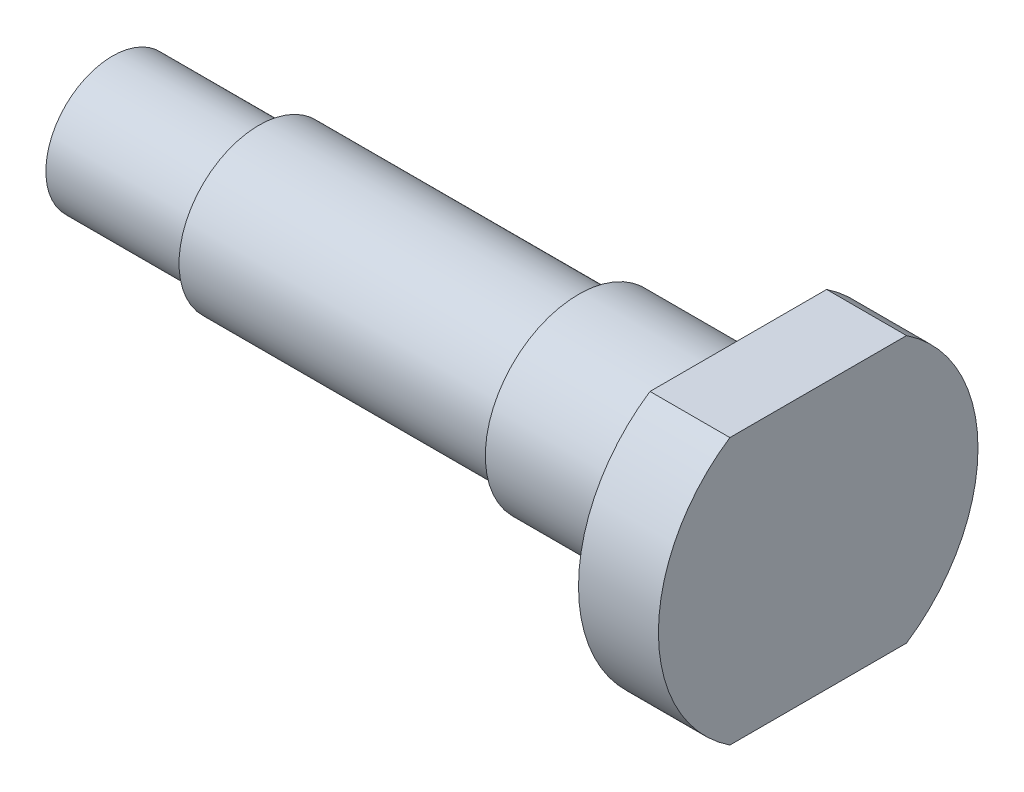
ISO-10303-21;
HEADER;
FILE_DESCRIPTION(('STEP AP214'),'2;1');
FILE_NAME('part.step','',(''),(''),'','','');
FILE_SCHEMA(('AUTOMOTIVE_DESIGN { 1 0 10303 214 1 1 1 1 }'));
ENDSEC;
DATA;
#1=APPLICATION_CONTEXT('core data for automotive mechanical design processes');
#2=APPLICATION_PROTOCOL_DEFINITION('international standard','automotive_design',2000,#1);
#3=PRODUCT_CONTEXT('',#1,'mechanical');
#4=PRODUCT('Part','Part','',(#3));
#5=PRODUCT_RELATED_PRODUCT_CATEGORY('part','',(#4));
#6=PRODUCT_DEFINITION_FORMATION('','',#4);
#7=PRODUCT_DEFINITION_CONTEXT('part definition',#1,'design');
#8=PRODUCT_DEFINITION('design','',#6,#7);
#9=PRODUCT_DEFINITION_SHAPE('','',#8);
#10=(LENGTH_UNIT() NAMED_UNIT(*) SI_UNIT(.MILLI.,.METRE.));
#11=(NAMED_UNIT(*) PLANE_ANGLE_UNIT() SI_UNIT($,.RADIAN.));
#12=(NAMED_UNIT(*) SI_UNIT($,.STERADIAN.) SOLID_ANGLE_UNIT());
#13=UNCERTAINTY_MEASURE_WITH_UNIT(LENGTH_MEASURE(1.E-05),#10,'distance_accuracy_value','');
#14=(GEOMETRIC_REPRESENTATION_CONTEXT(3) GLOBAL_UNCERTAINTY_ASSIGNED_CONTEXT((#13)) GLOBAL_UNIT_ASSIGNED_CONTEXT((#10,
#11,#12)) REPRESENTATION_CONTEXT('',''));
#15=CARTESIAN_POINT('',(0.,0.,0.));
#16=DIRECTION('',(0.,0.,1.));
#17=DIRECTION('',(1.,0.,0.));
#18=AXIS2_PLACEMENT_3D('',#15,#16,#17);
#19=CARTESIAN_POINT('',(-18.,0.,0.));
#20=DIRECTION('',(1.,0.,0.));
#21=DIRECTION('',(0.,0.,-1.));
#22=AXIS2_PLACEMENT_3D('',#19,#20,#21);
#23=CYLINDRICAL_SURFACE('',#22,3.);
#24=CARTESIAN_POINT('',(-18.,0.,0.));
#25=DIRECTION('',(1.,0.,0.));
#26=DIRECTION('',(0.,0.,-1.));
#27=AXIS2_PLACEMENT_3D('',#24,#25,#26);
#28=CIRCLE('',#27,3.);
#29=CARTESIAN_POINT('',(-18.,0.,-3.));
#30=VERTEX_POINT('',#29);
#31=EDGE_CURVE('E105',#30,#30,#28,.T.);
#32=ORIENTED_EDGE('',*,*,#31,.T.);
#33=EDGE_LOOP('',(#32));
#34=FACE_BOUND('',#33,.T.);
#35=CARTESIAN_POINT('',(-6.,0.,0.));
#36=DIRECTION('',(1.,0.,0.));
#37=DIRECTION('',(0.,0.,-1.));
#38=AXIS2_PLACEMENT_3D('',#35,#36,#37);
#39=CIRCLE('',#38,3.);
#40=CARTESIAN_POINT('',(-6.,0.,-3.));
#41=VERTEX_POINT('',#40);
#42=EDGE_CURVE('E176',#41,#41,#39,.T.);
#43=ORIENTED_EDGE('',*,*,#42,.F.);
#44=EDGE_LOOP('',(#43));
#45=FACE_BOUND('',#44,.T.);
#46=ADVANCED_FACE('F39',(#34,#45),#23,.T.);
#47=CARTESIAN_POINT('',(-18.,0.,0.));
#48=DIRECTION('',(1.,0.,0.));
#49=DIRECTION('',(0.,0.,-1.));
#50=AXIS2_PLACEMENT_3D('',#47,#48,#49);
#51=PLANE('',#50);
#52=CARTESIAN_POINT('',(-18.,0.,0.));
#53=DIRECTION('',(1.,0.,0.));
#54=DIRECTION('',(0.,0.,-1.));
#55=AXIS2_PLACEMENT_3D('',#52,#53,#54);
#56=CIRCLE('',#55,2.5);
#57=CARTESIAN_POINT('',(-18.,0.,-2.5));
#58=VERTEX_POINT('',#57);
#59=EDGE_CURVE('E168',#58,#58,#56,.T.);
#60=ORIENTED_EDGE('',*,*,#59,.T.);
#61=EDGE_LOOP('',(#60));
#62=FACE_BOUND('',#61,.T.);
#63=ORIENTED_EDGE('',*,*,#31,.F.);
#64=EDGE_LOOP('',(#63));
#65=FACE_BOUND('',#64,.T.);
#66=ADVANCED_FACE('F126',(#62,#65),#51,.F.);
#67=CARTESIAN_POINT('',(-23.5,0.,0.));
#68=DIRECTION('',(1.,0.,0.));
#69=DIRECTION('',(0.,0.,-1.));
#70=AXIS2_PLACEMENT_3D('',#67,#68,#69);
#71=CYLINDRICAL_SURFACE('',#70,2.5);
#72=CARTESIAN_POINT('',(-23.5,0.,0.));
#73=DIRECTION('',(1.,0.,0.));
#74=DIRECTION('',(0.,0.,-1.));
#75=AXIS2_PLACEMENT_3D('',#72,#73,#74);
#76=CIRCLE('',#75,2.5);
#77=CARTESIAN_POINT('',(-23.5,0.,-2.5));
#78=VERTEX_POINT('',#77);
#79=EDGE_CURVE('E165',#78,#78,#76,.T.);
#80=ORIENTED_EDGE('',*,*,#79,.T.);
#81=EDGE_LOOP('',(#80));
#82=FACE_BOUND('',#81,.T.);
#83=ORIENTED_EDGE('',*,*,#59,.F.);
#84=EDGE_LOOP('',(#83));
#85=FACE_BOUND('',#84,.T.);
#86=ADVANCED_FACE('F132',(#82,#85),#71,.T.);
#87=CARTESIAN_POINT('',(-23.5,0.,0.));
#88=DIRECTION('',(1.,0.,0.));
#89=DIRECTION('',(0.,0.,-1.));
#90=AXIS2_PLACEMENT_3D('',#87,#88,#89);
#91=PLANE('',#90);
#92=ORIENTED_EDGE('',*,*,#79,.F.);
#93=EDGE_LOOP('',(#92));
#94=FACE_BOUND('',#93,.T.);
#95=ADVANCED_FACE('F150',(#94),#91,.F.);
#96=CARTESIAN_POINT('',(-6.,0.,0.));
#97=DIRECTION('',(1.,0.,0.));
#98=DIRECTION('',(0.,0.,-1.));
#99=AXIS2_PLACEMENT_3D('',#96,#97,#98);
#100=CYLINDRICAL_SURFACE('',#99,3.5);
#101=CARTESIAN_POINT('',(-6.,0.,0.));
#102=DIRECTION('',(1.,0.,0.));
#103=DIRECTION('',(0.,0.,-1.));
#104=AXIS2_PLACEMENT_3D('',#101,#102,#103);
#105=CIRCLE('',#104,3.5);
#106=CARTESIAN_POINT('',(-6.,0.,-3.5));
#107=VERTEX_POINT('',#106);
#108=EDGE_CURVE('E171',#107,#107,#105,.T.);
#109=ORIENTED_EDGE('',*,*,#108,.T.);
#110=EDGE_LOOP('',(#109));
#111=FACE_BOUND('',#110,.T.);
#112=CARTESIAN_POINT('',(0.,0.,0.));
#113=DIRECTION('',(1.,0.,0.));
#114=DIRECTION('',(0.,0.,-1.));
#115=AXIS2_PLACEMENT_3D('',#112,#113,#114);
#116=CIRCLE('',#115,3.5);
#117=CARTESIAN_POINT('',(0.,0.,-3.5));
#118=VERTEX_POINT('',#117);
#119=EDGE_CURVE('E174',#118,#118,#116,.T.);
#120=ORIENTED_EDGE('',*,*,#119,.F.);
#121=EDGE_LOOP('',(#120));
#122=FACE_BOUND('',#121,.T.);
#123=ADVANCED_FACE('F144',(#111,#122),#100,.T.);
#124=CARTESIAN_POINT('',(-6.,0.,0.));
#125=DIRECTION('',(1.,0.,0.));
#126=DIRECTION('',(0.,0.,-1.));
#127=AXIS2_PLACEMENT_3D('',#124,#125,#126);
#128=PLANE('',#127);
#129=ORIENTED_EDGE('',*,*,#42,.T.);
#130=EDGE_LOOP('',(#129));
#131=FACE_BOUND('',#130,.T.);
#132=ORIENTED_EDGE('',*,*,#108,.F.);
#133=EDGE_LOOP('',(#132));
#134=FACE_BOUND('',#133,.T.);
#135=ADVANCED_FACE('F139',(#131,#134),#128,.F.);
#136=CARTESIAN_POINT('',(3.,0.,0.));
#137=DIRECTION('',(1.,0.,0.));
#138=DIRECTION('',(0.,0.,-1.));
#139=AXIS2_PLACEMENT_3D('',#136,#137,#138);
#140=PLANE('',#139);
#141=DIRECTION('',(0.,0.,-1.));
#142=VECTOR('',#141,1.);
#143=CARTESIAN_POINT('',(3.,-5.,0.));
#144=LINE('',#143,#142);
#145=CARTESIAN_POINT('',(3.,-5.,3.3166247903554));
#146=VERTEX_POINT('',#145);
#147=CARTESIAN_POINT('',(3.,-5.,-3.3166247903554));
#148=VERTEX_POINT('',#147);
#149=EDGE_CURVE('E87',#146,#148,#144,.T.);
#150=ORIENTED_EDGE('',*,*,#149,.T.);
#151=CARTESIAN_POINT('',(3.,0.,0.));
#152=DIRECTION('',(1.,0.,0.));
#153=DIRECTION('',(0.,0.,-1.));
#154=AXIS2_PLACEMENT_3D('',#151,#152,#153);
#155=CIRCLE('',#154,6.);
#156=CARTESIAN_POINT('',(3.,5.,-3.3166247903554));
#157=VERTEX_POINT('',#156);
#158=EDGE_CURVE('E82',#148,#157,#155,.T.);
#159=ORIENTED_EDGE('',*,*,#158,.T.);
#160=DIRECTION('',(0.,0.,-1.));
#161=VECTOR('',#160,1.);
#162=CARTESIAN_POINT('',(3.,5.,0.));
#163=LINE('',#162,#161);
#164=CARTESIAN_POINT('',(3.,5.,3.3166247903554));
#165=VERTEX_POINT('',#164);
#166=EDGE_CURVE('E85',#165,#157,#163,.T.);
#167=ORIENTED_EDGE('',*,*,#166,.F.);
#168=CARTESIAN_POINT('',(3.,0.,0.));
#169=DIRECTION('',(1.,0.,0.));
#170=DIRECTION('',(0.,0.,-1.));
#171=AXIS2_PLACEMENT_3D('',#168,#169,#170);
#172=CIRCLE('',#171,6.);
#173=EDGE_CURVE('E56',#165,#146,#172,.T.);
#174=ORIENTED_EDGE('',*,*,#173,.T.);
#175=EDGE_LOOP('',(#150,#159,#167,#174));
#176=FACE_BOUND('',#175,.T.);
#177=ADVANCED_FACE('F83',(#176),#140,.T.);
#178=CARTESIAN_POINT('',(3.,0.,0.));
#179=DIRECTION('',(-1.,0.,0.));
#180=DIRECTION('',(0.,0.,1.));
#181=AXIS2_PLACEMENT_3D('',#178,#179,#180);
#182=CYLINDRICAL_SURFACE('',#181,6.);
#183=CARTESIAN_POINT('',(0.,0.,0.));
#184=DIRECTION('',(1.,0.,0.));
#185=DIRECTION('',(0.,0.,-1.));
#186=AXIS2_PLACEMENT_3D('',#183,#184,#185);
#187=CIRCLE('',#186,6.);
#188=CARTESIAN_POINT('',(0.,-5.,-3.3166247903554));
#189=VERTEX_POINT('',#188);
#190=CARTESIAN_POINT('',(0.,5.,-3.3166247903554));
#191=VERTEX_POINT('',#190);
#192=EDGE_CURVE('E92',#189,#191,#187,.T.);
#193=ORIENTED_EDGE('',*,*,#192,.T.);
#194=DIRECTION('',(-1.,0.,0.));
#195=VECTOR('',#194,1.);
#196=CARTESIAN_POINT('',(3.,5.,-3.3166247903554));
#197=LINE('',#196,#195);
#198=EDGE_CURVE('E48',#157,#191,#197,.T.);
#199=ORIENTED_EDGE('',*,*,#198,.F.);
#200=ORIENTED_EDGE('',*,*,#158,.F.);
#201=DIRECTION('',(-1.,0.,0.));
#202=VECTOR('',#201,1.);
#203=CARTESIAN_POINT('',(3.,-5.,-3.3166247903554));
#204=LINE('',#203,#202);
#205=EDGE_CURVE('E11',#148,#189,#204,.T.);
#206=ORIENTED_EDGE('',*,*,#205,.T.);
#207=EDGE_LOOP('',(#193,#199,#200,#206));
#208=FACE_BOUND('',#207,.T.);
#209=ADVANCED_FACE('F91',(#208),#182,.T.);
#210=CARTESIAN_POINT('',(3.,5.,0.));
#211=DIRECTION('',(0.,1.,0.));
#212=DIRECTION('',(0.,0.,1.));
#213=AXIS2_PLACEMENT_3D('',#210,#211,#212);
#214=PLANE('',#213);
#215=DIRECTION('',(0.,0.,-1.));
#216=VECTOR('',#215,1.);
#217=CARTESIAN_POINT('',(0.,5.,0.));
#218=LINE('',#217,#216);
#219=CARTESIAN_POINT('',(0.,5.,3.3166247903554));
#220=VERTEX_POINT('',#219);
#221=EDGE_CURVE('E107',#220,#191,#218,.T.);
#222=ORIENTED_EDGE('',*,*,#221,.F.);
#223=DIRECTION('',(-1.,0.,0.));
#224=VECTOR('',#223,1.);
#225=CARTESIAN_POINT('',(3.,5.,3.3166247903554));
#226=LINE('',#225,#224);
#227=EDGE_CURVE('E72',#165,#220,#226,.T.);
#228=ORIENTED_EDGE('',*,*,#227,.F.);
#229=ORIENTED_EDGE('',*,*,#166,.T.);
#230=ORIENTED_EDGE('',*,*,#198,.T.);
#231=EDGE_LOOP('',(#222,#228,#229,#230));
#232=FACE_BOUND('',#231,.T.);
#233=ADVANCED_FACE('F96',(#232),#214,.T.);
#234=CARTESIAN_POINT('',(3.,0.,0.));
#235=DIRECTION('',(-1.,0.,0.));
#236=DIRECTION('',(0.,0.,1.));
#237=AXIS2_PLACEMENT_3D('',#234,#235,#236);
#238=CYLINDRICAL_SURFACE('',#237,6.);
#239=CARTESIAN_POINT('',(0.,0.,0.));
#240=DIRECTION('',(1.,0.,0.));
#241=DIRECTION('',(0.,0.,-1.));
#242=AXIS2_PLACEMENT_3D('',#239,#240,#241);
#243=CIRCLE('',#242,6.);
#244=CARTESIAN_POINT('',(0.,-5.,3.3166247903554));
#245=VERTEX_POINT('',#244);
#246=EDGE_CURVE('E75',#220,#245,#243,.T.);
#247=ORIENTED_EDGE('',*,*,#246,.T.);
#248=DIRECTION('',(-1.,0.,0.));
#249=VECTOR('',#248,1.);
#250=CARTESIAN_POINT('',(3.,-5.,3.3166247903554));
#251=LINE('',#250,#249);
#252=EDGE_CURVE('E98',#146,#245,#251,.T.);
#253=ORIENTED_EDGE('',*,*,#252,.F.);
#254=ORIENTED_EDGE('',*,*,#173,.F.);
#255=ORIENTED_EDGE('',*,*,#227,.T.);
#256=EDGE_LOOP('',(#247,#253,#254,#255));
#257=FACE_BOUND('',#256,.T.);
#258=ADVANCED_FACE('F121',(#257),#238,.T.);
#259=CARTESIAN_POINT('',(3.,-5.,0.));
#260=DIRECTION('',(0.,1.,0.));
#261=DIRECTION('',(0.,0.,1.));
#262=AXIS2_PLACEMENT_3D('',#259,#260,#261);
#263=PLANE('',#262);
#264=DIRECTION('',(0.,0.,-1.));
#265=VECTOR('',#264,1.);
#266=CARTESIAN_POINT('',(0.,-5.,0.));
#267=LINE('',#266,#265);
#268=EDGE_CURVE('E102',#245,#189,#267,.T.);
#269=ORIENTED_EDGE('',*,*,#268,.T.);
#270=ORIENTED_EDGE('',*,*,#205,.F.);
#271=ORIENTED_EDGE('',*,*,#149,.F.);
#272=ORIENTED_EDGE('',*,*,#252,.T.);
#273=EDGE_LOOP('',(#269,#270,#271,#272));
#274=FACE_BOUND('',#273,.T.);
#275=ADVANCED_FACE('F41',(#274),#263,.F.);
#276=CARTESIAN_POINT('',(0.,0.,0.));
#277=DIRECTION('',(1.,0.,0.));
#278=DIRECTION('',(0.,0.,-1.));
#279=AXIS2_PLACEMENT_3D('',#276,#277,#278);
#280=PLANE('',#279);
#281=ORIENTED_EDGE('',*,*,#119,.T.);
#282=EDGE_LOOP('',(#281));
#283=FACE_BOUND('',#282,.T.);
#284=ORIENTED_EDGE('',*,*,#268,.F.);
#285=ORIENTED_EDGE('',*,*,#246,.F.);
#286=ORIENTED_EDGE('',*,*,#221,.T.);
#287=ORIENTED_EDGE('',*,*,#192,.F.);
#288=EDGE_LOOP('',(#284,#285,#286,#287));
#289=FACE_BOUND('',#288,.T.);
#290=ADVANCED_FACE('F114',(#283,#289),#280,.F.);
#291=CLOSED_SHELL('',(#46,#66,#86,#95,#123,#135,#177,#209,#233,#258,#275,#290));
#292=MANIFOLD_SOLID_BREP('B2',#291);
#293=ADVANCED_BREP_SHAPE_REPRESENTATION('',(#18,#292),#14);
#294=SHAPE_DEFINITION_REPRESENTATION(#9,#293);
ENDSEC;
END-ISO-10303-21;
